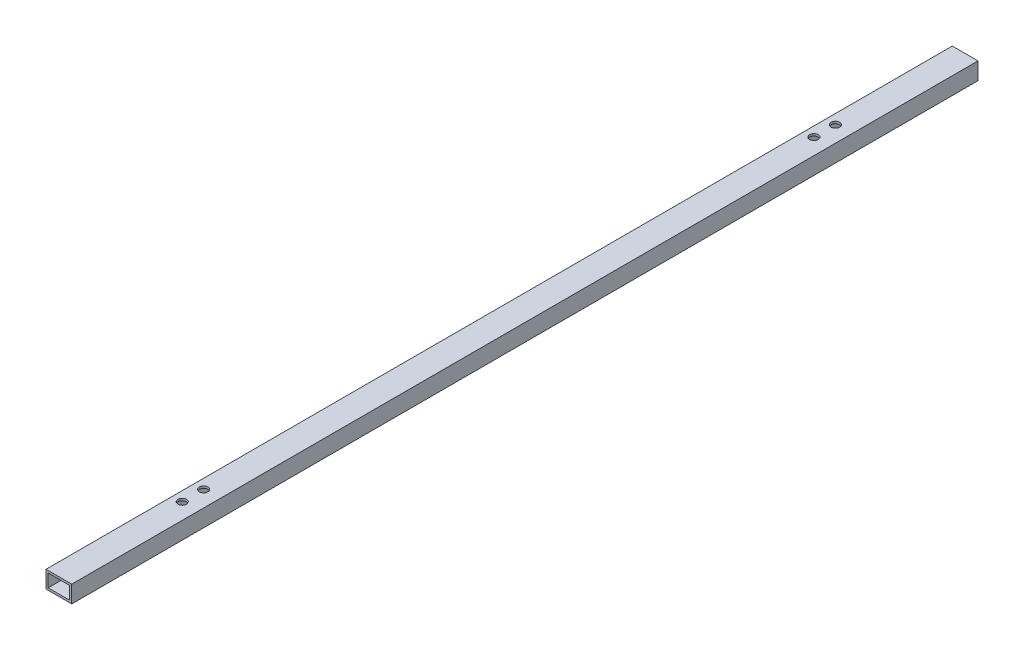
ISO-10303-21;
HEADER;
FILE_DESCRIPTION(('STEP AP214'),'2;1');
FILE_NAME('part.step','',(''),(''),'','','');
FILE_SCHEMA(('AUTOMOTIVE_DESIGN { 1 0 10303 214 1 1 1 1 }'));
ENDSEC;
DATA;
#1=APPLICATION_CONTEXT('core data for automotive mechanical design processes');
#2=APPLICATION_PROTOCOL_DEFINITION('international standard','automotive_design',2000,#1);
#3=PRODUCT_CONTEXT('',#1,'mechanical');
#4=PRODUCT('Part','Part','',(#3));
#5=PRODUCT_RELATED_PRODUCT_CATEGORY('part','',(#4));
#6=PRODUCT_DEFINITION_FORMATION('','',#4);
#7=PRODUCT_DEFINITION_CONTEXT('part definition',#1,'design');
#8=PRODUCT_DEFINITION('design','',#6,#7);
#9=PRODUCT_DEFINITION_SHAPE('','',#8);
#10=(LENGTH_UNIT() NAMED_UNIT(*) SI_UNIT(.MILLI.,.METRE.));
#11=(NAMED_UNIT(*) PLANE_ANGLE_UNIT() SI_UNIT($,.RADIAN.));
#12=(NAMED_UNIT(*) SI_UNIT($,.STERADIAN.) SOLID_ANGLE_UNIT());
#13=UNCERTAINTY_MEASURE_WITH_UNIT(LENGTH_MEASURE(1.E-05),#10,'distance_accuracy_value','');
#14=(GEOMETRIC_REPRESENTATION_CONTEXT(3) GLOBAL_UNCERTAINTY_ASSIGNED_CONTEXT((#13)) GLOBAL_UNIT_ASSIGNED_CONTEXT((#10,
#11,#12)) REPRESENTATION_CONTEXT('',''));
#15=CARTESIAN_POINT('',(0.,0.,0.));
#16=DIRECTION('',(0.,0.,1.));
#17=DIRECTION('',(1.,0.,0.));
#18=AXIS2_PLACEMENT_3D('',#15,#16,#17);
#19=CARTESIAN_POINT('',(19.05,-12.7,670.56));
#20=DIRECTION('',(0.,1.,0.));
#21=DIRECTION('',(0.,0.,1.));
#22=AXIS2_PLACEMENT_3D('',#19,#20,#21);
#23=PLANE('',#22);
#24=CARTESIAN_POINT('',(-4.7625,-12.7,-483.235));
#25=DIRECTION('',(0.,1.,0.));
#26=DIRECTION('',(0.,0.,1.));
#27=AXIS2_PLACEMENT_3D('',#24,#25,#26);
#28=CIRCLE('',#27,6.35);
#29=CARTESIAN_POINT('',(-4.7625,-12.7,-476.885));
#30=VERTEX_POINT('',#29);
#31=EDGE_CURVE('E202',#30,#30,#28,.T.);
#32=ORIENTED_EDGE('',*,*,#31,.T.);
#33=EDGE_LOOP('',(#32));
#34=FACE_BOUND('',#33,.T.);
#35=CARTESIAN_POINT('',(-4.76250000000001,-12.7,451.485));
#36=DIRECTION('',(0.,1.,0.));
#37=DIRECTION('',(0.,0.,1.));
#38=AXIS2_PLACEMENT_3D('',#35,#36,#37);
#39=CIRCLE('',#38,6.34999999999999);
#40=CARTESIAN_POINT('',(-4.76250000000001,-12.7,457.835));
#41=VERTEX_POINT('',#40);
#42=EDGE_CURVE('E176',#41,#41,#39,.T.);
#43=ORIENTED_EDGE('',*,*,#42,.T.);
#44=EDGE_LOOP('',(#43));
#45=FACE_BOUND('',#44,.T.);
#46=DIRECTION('',(0.,0.,-1.));
#47=VECTOR('',#46,1.);
#48=CARTESIAN_POINT('',(-19.05,-12.7,670.56));
#49=LINE('',#48,#47);
#50=CARTESIAN_POINT('',(-19.05,-12.7,670.56));
#51=VERTEX_POINT('',#50);
#52=CARTESIAN_POINT('',(-19.05,-12.7,-670.56));
#53=VERTEX_POINT('',#52);
#54=EDGE_CURVE('E11',#51,#53,#49,.T.);
#55=ORIENTED_EDGE('',*,*,#54,.T.);
#56=DIRECTION('',(1.,0.,0.));
#57=VECTOR('',#56,1.);
#58=CARTESIAN_POINT('',(19.05,-12.7,-670.56));
#59=LINE('',#58,#57);
#60=CARTESIAN_POINT('',(19.05,-12.7,-670.56));
#61=VERTEX_POINT('',#60);
#62=EDGE_CURVE('E141',#53,#61,#59,.T.);
#63=ORIENTED_EDGE('',*,*,#62,.T.);
#64=DIRECTION('',(0.,0.,-1.));
#65=VECTOR('',#64,1.);
#66=CARTESIAN_POINT('',(19.05,-12.7,670.56));
#67=LINE('',#66,#65);
#68=CARTESIAN_POINT('',(19.05,-12.7,670.56));
#69=VERTEX_POINT('',#68);
#70=EDGE_CURVE('E45',#69,#61,#67,.T.);
#71=ORIENTED_EDGE('',*,*,#70,.F.);
#72=DIRECTION('',(1.,0.,0.));
#73=VECTOR('',#72,1.);
#74=CARTESIAN_POINT('',(19.05,-12.7,670.56));
#75=LINE('',#74,#73);
#76=EDGE_CURVE('E162',#51,#69,#75,.T.);
#77=ORIENTED_EDGE('',*,*,#76,.F.);
#78=EDGE_LOOP('',(#55,#63,#71,#77));
#79=FACE_BOUND('',#78,.T.);
#80=CARTESIAN_POINT('',(-4.7625,-12.7,-451.485));
#81=DIRECTION('',(0.,1.,0.));
#82=DIRECTION('',(0.,0.,1.));
#83=AXIS2_PLACEMENT_3D('',#80,#81,#82);
#84=CIRCLE('',#83,6.35);
#85=CARTESIAN_POINT('',(-4.7625,-12.7,-445.135));
#86=VERTEX_POINT('',#85);
#87=EDGE_CURVE('E203',#86,#86,#84,.F.);
#88=ORIENTED_EDGE('',*,*,#87,.F.);
#89=EDGE_LOOP('',(#88));
#90=FACE_BOUND('',#89,.T.);
#91=CARTESIAN_POINT('',(-4.76250000000001,-12.7,483.235));
#92=DIRECTION('',(0.,1.,0.));
#93=DIRECTION('',(0.,0.,1.));
#94=AXIS2_PLACEMENT_3D('',#91,#92,#93);
#95=CIRCLE('',#94,6.34999999999999);
#96=CARTESIAN_POINT('',(-4.76250000000001,-12.7,489.585));
#97=VERTEX_POINT('',#96);
#98=EDGE_CURVE('E196',#97,#97,#95,.F.);
#99=ORIENTED_EDGE('',*,*,#98,.F.);
#100=EDGE_LOOP('',(#99));
#101=FACE_BOUND('',#100,.T.);
#102=ADVANCED_FACE('F36',(#34,#45,#79,#90,#101),#23,.F.);
#103=CARTESIAN_POINT('',(19.05,12.7,670.56));
#104=DIRECTION('',(0.,-1.,0.));
#105=DIRECTION('',(0.,0.,-1.));
#106=AXIS2_PLACEMENT_3D('',#103,#104,#105);
#107=PLANE('',#106);
#108=CARTESIAN_POINT('',(-4.7625,12.7,-483.235));
#109=DIRECTION('',(0.,1.,0.));
#110=DIRECTION('',(0.,0.,1.));
#111=AXIS2_PLACEMENT_3D('',#108,#109,#110);
#112=CIRCLE('',#111,6.35);
#113=CARTESIAN_POINT('',(-4.7625,12.7,-476.885));
#114=VERTEX_POINT('',#113);
#115=EDGE_CURVE('E199',#114,#114,#112,.T.);
#116=ORIENTED_EDGE('',*,*,#115,.F.);
#117=EDGE_LOOP('',(#116));
#118=FACE_BOUND('',#117,.T.);
#119=CARTESIAN_POINT('',(-4.76250000000001,12.7,451.485));
#120=DIRECTION('',(0.,1.,0.));
#121=DIRECTION('',(0.,0.,1.));
#122=AXIS2_PLACEMENT_3D('',#119,#120,#121);
#123=CIRCLE('',#122,6.34999999999999);
#124=CARTESIAN_POINT('',(-4.76250000000001,12.7,457.835));
#125=VERTEX_POINT('',#124);
#126=EDGE_CURVE('E193',#125,#125,#123,.T.);
#127=ORIENTED_EDGE('',*,*,#126,.F.);
#128=EDGE_LOOP('',(#127));
#129=FACE_BOUND('',#128,.T.);
#130=DIRECTION('',(0.,0.,-1.));
#131=VECTOR('',#130,1.);
#132=CARTESIAN_POINT('',(19.05,12.7,670.56));
#133=LINE('',#132,#131);
#134=CARTESIAN_POINT('',(19.05,12.7,670.56));
#135=VERTEX_POINT('',#134);
#136=CARTESIAN_POINT('',(19.05,12.7,-670.56));
#137=VERTEX_POINT('',#136);
#138=EDGE_CURVE('E169',#135,#137,#133,.T.);
#139=ORIENTED_EDGE('',*,*,#138,.T.);
#140=DIRECTION('',(-1.,0.,0.));
#141=VECTOR('',#140,1.);
#142=CARTESIAN_POINT('',(19.05,12.7,-670.56));
#143=LINE('',#142,#141);
#144=CARTESIAN_POINT('',(-19.05,12.7,-670.56));
#145=VERTEX_POINT('',#144);
#146=EDGE_CURVE('E147',#137,#145,#143,.T.);
#147=ORIENTED_EDGE('',*,*,#146,.T.);
#148=DIRECTION('',(0.,0.,-1.));
#149=VECTOR('',#148,1.);
#150=CARTESIAN_POINT('',(-19.05,12.7,670.56));
#151=LINE('',#150,#149);
#152=CARTESIAN_POINT('',(-19.05,12.7,670.56));
#153=VERTEX_POINT('',#152);
#154=EDGE_CURVE('E167',#153,#145,#151,.T.);
#155=ORIENTED_EDGE('',*,*,#154,.F.);
#156=DIRECTION('',(-1.,0.,0.));
#157=VECTOR('',#156,1.);
#158=CARTESIAN_POINT('',(19.05,12.7,670.56));
#159=LINE('',#158,#157);
#160=EDGE_CURVE('E61',#135,#153,#159,.T.);
#161=ORIENTED_EDGE('',*,*,#160,.F.);
#162=EDGE_LOOP('',(#139,#147,#155,#161));
#163=FACE_BOUND('',#162,.T.);
#164=CARTESIAN_POINT('',(-4.7625,12.7,-451.485));
#165=DIRECTION('',(0.,1.,0.));
#166=DIRECTION('',(0.,0.,1.));
#167=AXIS2_PLACEMENT_3D('',#164,#165,#166);
#168=CIRCLE('',#167,6.35);
#169=CARTESIAN_POINT('',(-4.7625,12.7,-445.135));
#170=VERTEX_POINT('',#169);
#171=EDGE_CURVE('E211',#170,#170,#168,.F.);
#172=ORIENTED_EDGE('',*,*,#171,.T.);
#173=EDGE_LOOP('',(#172));
#174=FACE_BOUND('',#173,.T.);
#175=CARTESIAN_POINT('',(-4.76250000000001,12.7,483.235));
#176=DIRECTION('',(0.,1.,0.));
#177=DIRECTION('',(0.,0.,1.));
#178=AXIS2_PLACEMENT_3D('',#175,#176,#177);
#179=CIRCLE('',#178,6.34999999999999);
#180=CARTESIAN_POINT('',(-4.76250000000001,12.7,489.585));
#181=VERTEX_POINT('',#180);
#182=EDGE_CURVE('E206',#181,#181,#179,.F.);
#183=ORIENTED_EDGE('',*,*,#182,.T.);
#184=EDGE_LOOP('',(#183));
#185=FACE_BOUND('',#184,.T.);
#186=ADVANCED_FACE('F221',(#118,#129,#163,#174,#185),#107,.F.);
#187=CARTESIAN_POINT('',(15.875,-9.525,670.56));
#188=DIRECTION('',(0.,1.,0.));
#189=DIRECTION('',(0.,0.,1.));
#190=AXIS2_PLACEMENT_3D('',#187,#188,#189);
#191=PLANE('',#190);
#192=CARTESIAN_POINT('',(-4.7625,-9.525,-451.485));
#193=DIRECTION('',(0.,1.,0.));
#194=DIRECTION('',(0.,0.,1.));
#195=AXIS2_PLACEMENT_3D('',#192,#193,#194);
#196=CIRCLE('',#195,6.35);
#197=CARTESIAN_POINT('',(-4.7625,-9.525,-445.135));
#198=VERTEX_POINT('',#197);
#199=EDGE_CURVE('E179',#198,#198,#196,.F.);
#200=ORIENTED_EDGE('',*,*,#199,.T.);
#201=EDGE_LOOP('',(#200));
#202=FACE_BOUND('',#201,.T.);
#203=CARTESIAN_POINT('',(-4.76250000000001,-9.525,451.485));
#204=DIRECTION('',(0.,1.,0.));
#205=DIRECTION('',(0.,0.,1.));
#206=AXIS2_PLACEMENT_3D('',#203,#204,#205);
#207=CIRCLE('',#206,6.34999999999999);
#208=CARTESIAN_POINT('',(-4.76250000000001,-9.525,457.835));
#209=VERTEX_POINT('',#208);
#210=EDGE_CURVE('E175',#209,#209,#207,.T.);
#211=ORIENTED_EDGE('',*,*,#210,.F.);
#212=EDGE_LOOP('',(#211));
#213=FACE_BOUND('',#212,.T.);
#214=DIRECTION('',(0.,0.,-1.));
#215=VECTOR('',#214,1.);
#216=CARTESIAN_POINT('',(15.875,-9.525,670.56));
#217=LINE('',#216,#215);
#218=CARTESIAN_POINT('',(15.875,-9.525,670.56));
#219=VERTEX_POINT('',#218);
#220=CARTESIAN_POINT('',(15.875,-9.525,-670.56));
#221=VERTEX_POINT('',#220);
#222=EDGE_CURVE('E115',#219,#221,#217,.T.);
#223=ORIENTED_EDGE('',*,*,#222,.T.);
#224=DIRECTION('',(1.,0.,0.));
#225=VECTOR('',#224,1.);
#226=CARTESIAN_POINT('',(15.875,-9.525,-670.56));
#227=LINE('',#226,#225);
#228=CARTESIAN_POINT('',(-15.875,-9.525,-670.56));
#229=VERTEX_POINT('',#228);
#230=EDGE_CURVE('E118',#229,#221,#227,.T.);
#231=ORIENTED_EDGE('',*,*,#230,.F.);
#232=DIRECTION('',(0.,0.,-1.));
#233=VECTOR('',#232,1.);
#234=CARTESIAN_POINT('',(-15.875,-9.525,670.56));
#235=LINE('',#234,#233);
#236=CARTESIAN_POINT('',(-15.875,-9.525,670.56));
#237=VERTEX_POINT('',#236);
#238=EDGE_CURVE('E103',#237,#229,#235,.T.);
#239=ORIENTED_EDGE('',*,*,#238,.F.);
#240=DIRECTION('',(1.,0.,0.));
#241=VECTOR('',#240,1.);
#242=CARTESIAN_POINT('',(15.875,-9.525,670.56));
#243=LINE('',#242,#241);
#244=EDGE_CURVE('E151',#237,#219,#243,.T.);
#245=ORIENTED_EDGE('',*,*,#244,.T.);
#246=EDGE_LOOP('',(#223,#231,#239,#245));
#247=FACE_BOUND('',#246,.T.);
#248=CARTESIAN_POINT('',(-4.7625,-9.525,-483.235));
#249=DIRECTION('',(0.,1.,0.));
#250=DIRECTION('',(0.,0.,1.));
#251=AXIS2_PLACEMENT_3D('',#248,#249,#250);
#252=CIRCLE('',#251,6.35);
#253=CARTESIAN_POINT('',(-4.7625,-9.525,-476.885));
#254=VERTEX_POINT('',#253);
#255=EDGE_CURVE('E182',#254,#254,#252,.T.);
#256=ORIENTED_EDGE('',*,*,#255,.F.);
#257=EDGE_LOOP('',(#256));
#258=FACE_BOUND('',#257,.T.);
#259=CARTESIAN_POINT('',(-4.76250000000001,-9.525,483.235));
#260=DIRECTION('',(0.,1.,0.));
#261=DIRECTION('',(0.,0.,1.));
#262=AXIS2_PLACEMENT_3D('',#259,#260,#261);
#263=CIRCLE('',#262,6.34999999999999);
#264=CARTESIAN_POINT('',(-4.76250000000001,-9.525,489.585));
#265=VERTEX_POINT('',#264);
#266=EDGE_CURVE('E130',#265,#265,#263,.F.);
#267=ORIENTED_EDGE('',*,*,#266,.T.);
#268=EDGE_LOOP('',(#267));
#269=FACE_BOUND('',#268,.T.);
#270=ADVANCED_FACE('F119',(#202,#213,#247,#258,#269),#191,.T.);
#271=CARTESIAN_POINT('',(15.875,9.525,670.56));
#272=DIRECTION('',(0.,-1.,0.));
#273=DIRECTION('',(1.,0.,0.));
#274=AXIS2_PLACEMENT_3D('',#271,#272,#273);
#275=PLANE('',#274);
#276=CARTESIAN_POINT('',(-4.7625,9.525,-451.485));
#277=DIRECTION('',(0.,-1.,0.));
#278=DIRECTION('',(1.,0.,0.));
#279=AXIS2_PLACEMENT_3D('',#276,#277,#278);
#280=CIRCLE('',#279,6.35);
#281=CARTESIAN_POINT('',(1.5875,9.525,-451.485));
#282=VERTEX_POINT('',#281);
#283=EDGE_CURVE('E177',#282,#282,#280,.F.);
#284=ORIENTED_EDGE('',*,*,#283,.T.);
#285=EDGE_LOOP('',(#284));
#286=FACE_BOUND('',#285,.T.);
#287=CARTESIAN_POINT('',(-4.76250000000001,9.525,451.485));
#288=DIRECTION('',(0.,-1.,0.));
#289=DIRECTION('',(1.,0.,0.));
#290=AXIS2_PLACEMENT_3D('',#287,#288,#289);
#291=CIRCLE('',#290,6.34999999999999);
#292=CARTESIAN_POINT('',(1.58749999999999,9.525,451.485));
#293=VERTEX_POINT('',#292);
#294=EDGE_CURVE('E172',#293,#293,#291,.T.);
#295=ORIENTED_EDGE('',*,*,#294,.F.);
#296=EDGE_LOOP('',(#295));
#297=FACE_BOUND('',#296,.T.);
#298=DIRECTION('',(0.,0.,-1.));
#299=VECTOR('',#298,1.);
#300=CARTESIAN_POINT('',(-15.875,9.525,670.56));
#301=LINE('',#300,#299);
#302=CARTESIAN_POINT('',(-15.875,9.525,670.56));
#303=VERTEX_POINT('',#302);
#304=CARTESIAN_POINT('',(-15.875,9.525,-670.56));
#305=VERTEX_POINT('',#304);
#306=EDGE_CURVE('E157',#303,#305,#301,.T.);
#307=ORIENTED_EDGE('',*,*,#306,.T.);
#308=DIRECTION('',(-1.,0.,0.));
#309=VECTOR('',#308,1.);
#310=CARTESIAN_POINT('',(15.875,9.525,-670.56));
#311=LINE('',#310,#309);
#312=CARTESIAN_POINT('',(15.875,9.525,-670.56));
#313=VERTEX_POINT('',#312);
#314=EDGE_CURVE('E129',#313,#305,#311,.T.);
#315=ORIENTED_EDGE('',*,*,#314,.F.);
#316=DIRECTION('',(0.,0.,-1.));
#317=VECTOR('',#316,1.);
#318=CARTESIAN_POINT('',(15.875,9.525,670.56));
#319=LINE('',#318,#317);
#320=CARTESIAN_POINT('',(15.875,9.525,670.56));
#321=VERTEX_POINT('',#320);
#322=EDGE_CURVE('E53',#321,#313,#319,.T.);
#323=ORIENTED_EDGE('',*,*,#322,.F.);
#324=DIRECTION('',(-1.,0.,0.));
#325=VECTOR('',#324,1.);
#326=CARTESIAN_POINT('',(15.875,9.525,670.56));
#327=LINE('',#326,#325);
#328=EDGE_CURVE('E155',#321,#303,#327,.T.);
#329=ORIENTED_EDGE('',*,*,#328,.T.);
#330=EDGE_LOOP('',(#307,#315,#323,#329));
#331=FACE_BOUND('',#330,.T.);
#332=CARTESIAN_POINT('',(-4.7625,9.525,-483.235));
#333=DIRECTION('',(0.,-1.,0.));
#334=DIRECTION('',(1.,0.,0.));
#335=AXIS2_PLACEMENT_3D('',#332,#333,#334);
#336=CIRCLE('',#335,6.35);
#337=CARTESIAN_POINT('',(1.5875,9.525,-483.235));
#338=VERTEX_POINT('',#337);
#339=EDGE_CURVE('E180',#338,#338,#336,.T.);
#340=ORIENTED_EDGE('',*,*,#339,.F.);
#341=EDGE_LOOP('',(#340));
#342=FACE_BOUND('',#341,.T.);
#343=CARTESIAN_POINT('',(-4.76250000000001,9.525,483.235));
#344=DIRECTION('',(0.,-1.,0.));
#345=DIRECTION('',(1.,0.,0.));
#346=AXIS2_PLACEMENT_3D('',#343,#344,#345);
#347=CIRCLE('',#346,6.34999999999999);
#348=CARTESIAN_POINT('',(1.58749999999999,9.525,483.235));
#349=VERTEX_POINT('',#348);
#350=EDGE_CURVE('E40',#349,#349,#347,.F.);
#351=ORIENTED_EDGE('',*,*,#350,.T.);
#352=EDGE_LOOP('',(#351));
#353=FACE_BOUND('',#352,.T.);
#354=ADVANCED_FACE('F261',(#286,#297,#331,#342,#353),#275,.T.);
#355=CARTESIAN_POINT('',(0.,0.,670.56));
#356=DIRECTION('',(0.,0.,1.));
#357=DIRECTION('',(1.,0.,0.));
#358=AXIS2_PLACEMENT_3D('',#355,#356,#357);
#359=PLANE('',#358);
#360=DIRECTION('',(0.,-1.,0.));
#361=VECTOR('',#360,1.);
#362=CARTESIAN_POINT('',(-19.05,-12.7,670.56));
#363=LINE('',#362,#361);
#364=EDGE_CURVE('E114',#153,#51,#363,.T.);
#365=ORIENTED_EDGE('',*,*,#364,.T.);
#366=ORIENTED_EDGE('',*,*,#76,.T.);
#367=DIRECTION('',(0.,1.,0.));
#368=VECTOR('',#367,1.);
#369=CARTESIAN_POINT('',(19.05,-12.7,670.56));
#370=LINE('',#369,#368);
#371=EDGE_CURVE('E164',#69,#135,#370,.T.);
#372=ORIENTED_EDGE('',*,*,#371,.T.);
#373=ORIENTED_EDGE('',*,*,#160,.T.);
#374=EDGE_LOOP('',(#365,#366,#372,#373));
#375=FACE_BOUND('',#374,.T.);
#376=ORIENTED_EDGE('',*,*,#244,.F.);
#377=DIRECTION('',(0.,-1.,0.));
#378=VECTOR('',#377,1.);
#379=CARTESIAN_POINT('',(-15.875,-9.525,670.56));
#380=LINE('',#379,#378);
#381=EDGE_CURVE('E111',#303,#237,#380,.T.);
#382=ORIENTED_EDGE('',*,*,#381,.F.);
#383=ORIENTED_EDGE('',*,*,#328,.F.);
#384=DIRECTION('',(0.,1.,0.));
#385=VECTOR('',#384,1.);
#386=CARTESIAN_POINT('',(15.875,-9.525,670.56));
#387=LINE('',#386,#385);
#388=EDGE_CURVE('E153',#219,#321,#387,.T.);
#389=ORIENTED_EDGE('',*,*,#388,.F.);
#390=EDGE_LOOP('',(#376,#382,#383,#389));
#391=FACE_BOUND('',#390,.T.);
#392=ADVANCED_FACE('F267',(#375,#391),#359,.T.);
#393=CARTESIAN_POINT('',(-19.05,-12.7,670.56));
#394=DIRECTION('',(1.,0.,0.));
#395=DIRECTION('',(0.,0.,-1.));
#396=AXIS2_PLACEMENT_3D('',#393,#394,#395);
#397=PLANE('',#396);
#398=ORIENTED_EDGE('',*,*,#154,.T.);
#399=DIRECTION('',(0.,-1.,0.));
#400=VECTOR('',#399,1.);
#401=CARTESIAN_POINT('',(-19.05,-12.7,-670.56));
#402=LINE('',#401,#400);
#403=EDGE_CURVE('E138',#145,#53,#402,.T.);
#404=ORIENTED_EDGE('',*,*,#403,.T.);
#405=ORIENTED_EDGE('',*,*,#54,.F.);
#406=ORIENTED_EDGE('',*,*,#364,.F.);
#407=EDGE_LOOP('',(#398,#404,#405,#406));
#408=FACE_BOUND('',#407,.T.);
#409=ADVANCED_FACE('F38',(#408),#397,.F.);
#410=CARTESIAN_POINT('',(19.05,-12.7,670.56));
#411=DIRECTION('',(-1.,0.,0.));
#412=DIRECTION('',(0.,-1.,0.));
#413=AXIS2_PLACEMENT_3D('',#410,#411,#412);
#414=PLANE('',#413);
#415=ORIENTED_EDGE('',*,*,#70,.T.);
#416=DIRECTION('',(0.,1.,0.));
#417=VECTOR('',#416,1.);
#418=CARTESIAN_POINT('',(19.05,-12.7,-670.56));
#419=LINE('',#418,#417);
#420=EDGE_CURVE('E144',#61,#137,#419,.T.);
#421=ORIENTED_EDGE('',*,*,#420,.T.);
#422=ORIENTED_EDGE('',*,*,#138,.F.);
#423=ORIENTED_EDGE('',*,*,#371,.F.);
#424=EDGE_LOOP('',(#415,#421,#422,#423));
#425=FACE_BOUND('',#424,.T.);
#426=ADVANCED_FACE('F269',(#425),#414,.F.);
#427=CARTESIAN_POINT('',(-15.875,-9.525,670.56));
#428=DIRECTION('',(1.,0.,0.));
#429=DIRECTION('',(0.,0.,-1.));
#430=AXIS2_PLACEMENT_3D('',#427,#428,#429);
#431=PLANE('',#430);
#432=ORIENTED_EDGE('',*,*,#238,.T.);
#433=DIRECTION('',(0.,-1.,0.));
#434=VECTOR('',#433,1.);
#435=CARTESIAN_POINT('',(-15.875,-9.525,-670.56));
#436=LINE('',#435,#434);
#437=EDGE_CURVE('E108',#305,#229,#436,.T.);
#438=ORIENTED_EDGE('',*,*,#437,.F.);
#439=ORIENTED_EDGE('',*,*,#306,.F.);
#440=ORIENTED_EDGE('',*,*,#381,.T.);
#441=EDGE_LOOP('',(#432,#438,#439,#440));
#442=FACE_BOUND('',#441,.T.);
#443=ADVANCED_FACE('F105',(#442),#431,.T.);
#444=CARTESIAN_POINT('',(15.875,-9.525,670.56));
#445=DIRECTION('',(-1.,0.,0.));
#446=DIRECTION('',(0.,0.,1.));
#447=AXIS2_PLACEMENT_3D('',#444,#445,#446);
#448=PLANE('',#447);
#449=ORIENTED_EDGE('',*,*,#322,.T.);
#450=DIRECTION('',(0.,1.,0.));
#451=VECTOR('',#450,1.);
#452=CARTESIAN_POINT('',(15.875,-9.525,-670.56));
#453=LINE('',#452,#451);
#454=EDGE_CURVE('E125',#221,#313,#453,.T.);
#455=ORIENTED_EDGE('',*,*,#454,.F.);
#456=ORIENTED_EDGE('',*,*,#222,.F.);
#457=ORIENTED_EDGE('',*,*,#388,.T.);
#458=EDGE_LOOP('',(#449,#455,#456,#457));
#459=FACE_BOUND('',#458,.T.);
#460=ADVANCED_FACE('F276',(#459),#448,.T.);
#461=CARTESIAN_POINT('',(0.,0.,-670.56));
#462=DIRECTION('',(0.,0.,1.));
#463=DIRECTION('',(1.,0.,0.));
#464=AXIS2_PLACEMENT_3D('',#461,#462,#463);
#465=PLANE('',#464);
#466=ORIENTED_EDGE('',*,*,#314,.T.);
#467=ORIENTED_EDGE('',*,*,#437,.T.);
#468=ORIENTED_EDGE('',*,*,#230,.T.);
#469=ORIENTED_EDGE('',*,*,#454,.T.);
#470=EDGE_LOOP('',(#466,#467,#468,#469));
#471=FACE_BOUND('',#470,.T.);
#472=ORIENTED_EDGE('',*,*,#403,.F.);
#473=ORIENTED_EDGE('',*,*,#146,.F.);
#474=ORIENTED_EDGE('',*,*,#420,.F.);
#475=ORIENTED_EDGE('',*,*,#62,.F.);
#476=EDGE_LOOP('',(#472,#473,#474,#475));
#477=FACE_BOUND('',#476,.T.);
#478=ADVANCED_FACE('F127',(#471,#477),#465,.F.);
#479=CARTESIAN_POINT('',(-4.76250000000001,-12.7,451.485));
#480=DIRECTION('',(0.,1.,0.));
#481=DIRECTION('',(0.,0.,1.));
#482=AXIS2_PLACEMENT_3D('',#479,#480,#481);
#483=CYLINDRICAL_SURFACE('',#482,6.34999999999999);
#484=ORIENTED_EDGE('',*,*,#294,.T.);
#485=EDGE_LOOP('',(#484));
#486=FACE_BOUND('',#485,.T.);
#487=ORIENTED_EDGE('',*,*,#126,.T.);
#488=EDGE_LOOP('',(#487));
#489=FACE_BOUND('',#488,.T.);
#490=ADVANCED_FACE('F248',(#486,#489),#483,.F.);
#491=CARTESIAN_POINT('',(-4.7625,-12.7,-451.485));
#492=DIRECTION('',(0.,1.,0.));
#493=DIRECTION('',(0.,0.,1.));
#494=AXIS2_PLACEMENT_3D('',#491,#492,#493);
#495=CYLINDRICAL_SURFACE('',#494,6.35);
#496=ORIENTED_EDGE('',*,*,#283,.F.);
#497=EDGE_LOOP('',(#496));
#498=FACE_BOUND('',#497,.T.);
#499=ORIENTED_EDGE('',*,*,#171,.F.);
#500=EDGE_LOOP('',(#499));
#501=FACE_BOUND('',#500,.T.);
#502=ADVANCED_FACE('F249',(#498,#501),#495,.F.);
#503=CARTESIAN_POINT('',(-4.7625,-12.7,-483.235));
#504=DIRECTION('',(0.,1.,0.));
#505=DIRECTION('',(0.,0.,1.));
#506=AXIS2_PLACEMENT_3D('',#503,#504,#505);
#507=CYLINDRICAL_SURFACE('',#506,6.35);
#508=ORIENTED_EDGE('',*,*,#339,.T.);
#509=EDGE_LOOP('',(#508));
#510=FACE_BOUND('',#509,.T.);
#511=ORIENTED_EDGE('',*,*,#115,.T.);
#512=EDGE_LOOP('',(#511));
#513=FACE_BOUND('',#512,.T.);
#514=ADVANCED_FACE('F236',(#510,#513),#507,.F.);
#515=CARTESIAN_POINT('',(-4.76250000000001,-12.7,483.235));
#516=DIRECTION('',(0.,1.,0.));
#517=DIRECTION('',(0.,0.,1.));
#518=AXIS2_PLACEMENT_3D('',#515,#516,#517);
#519=CYLINDRICAL_SURFACE('',#518,6.34999999999999);
#520=ORIENTED_EDGE('',*,*,#350,.F.);
#521=EDGE_LOOP('',(#520));
#522=FACE_BOUND('',#521,.T.);
#523=ORIENTED_EDGE('',*,*,#182,.F.);
#524=EDGE_LOOP('',(#523));
#525=FACE_BOUND('',#524,.T.);
#526=ADVANCED_FACE('F230',(#522,#525),#519,.F.);
#527=ORIENTED_EDGE('',*,*,#210,.T.);
#528=EDGE_LOOP('',(#527));
#529=FACE_BOUND('',#528,.T.);
#530=ORIENTED_EDGE('',*,*,#42,.F.);
#531=EDGE_LOOP('',(#530));
#532=FACE_BOUND('',#531,.T.);
#533=ADVANCED_FACE('F240',(#529,#532),#483,.F.);
#534=ORIENTED_EDGE('',*,*,#199,.F.);
#535=EDGE_LOOP('',(#534));
#536=FACE_BOUND('',#535,.T.);
#537=ORIENTED_EDGE('',*,*,#87,.T.);
#538=EDGE_LOOP('',(#537));
#539=FACE_BOUND('',#538,.T.);
#540=ADVANCED_FACE('F217',(#536,#539),#495,.F.);
#541=ORIENTED_EDGE('',*,*,#255,.T.);
#542=EDGE_LOOP('',(#541));
#543=FACE_BOUND('',#542,.T.);
#544=ORIENTED_EDGE('',*,*,#31,.F.);
#545=EDGE_LOOP('',(#544));
#546=FACE_BOUND('',#545,.T.);
#547=ADVANCED_FACE('F227',(#543,#546),#507,.F.);
#548=ORIENTED_EDGE('',*,*,#266,.F.);
#549=EDGE_LOOP('',(#548));
#550=FACE_BOUND('',#549,.T.);
#551=ORIENTED_EDGE('',*,*,#98,.T.);
#552=EDGE_LOOP('',(#551));
#553=FACE_BOUND('',#552,.T.);
#554=ADVANCED_FACE('F225',(#550,#553),#519,.F.);
#555=CLOSED_SHELL('',(#102,#186,#270,#354,#392,#409,#426,#443,#460,#478,#490,#502,#514,#526,
#533,#540,#547,#554));
#556=MANIFOLD_SOLID_BREP('B2',#555);
#557=ADVANCED_BREP_SHAPE_REPRESENTATION('',(#18,#556),#14);
#558=SHAPE_DEFINITION_REPRESENTATION(#9,#557);
ENDSEC;
END-ISO-10303-21;
